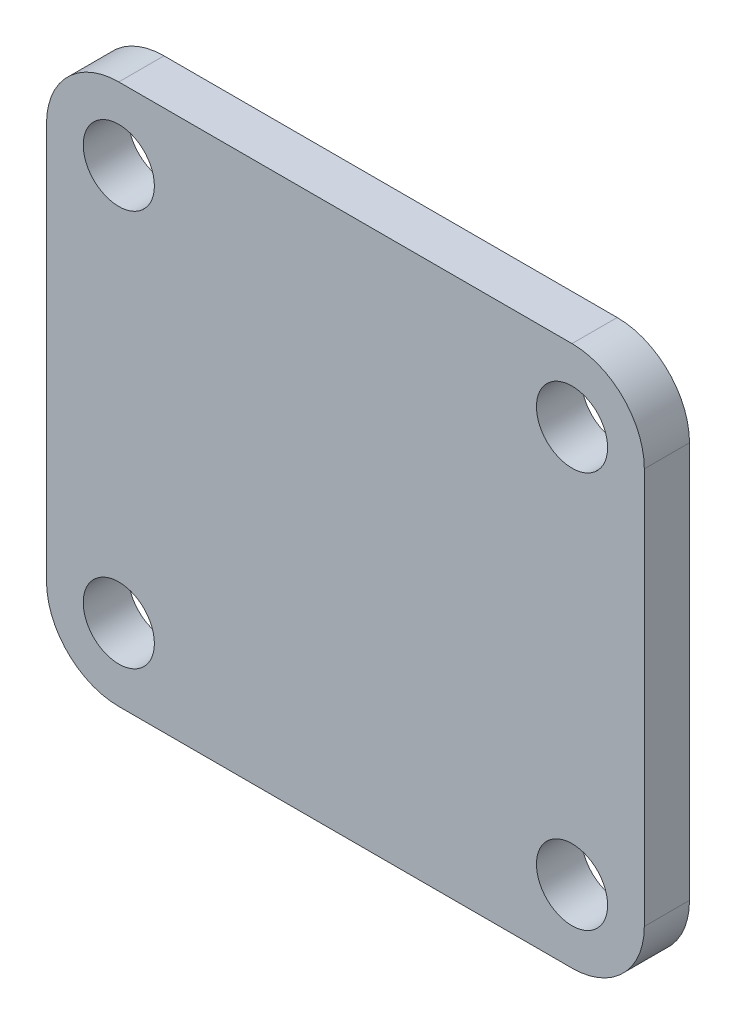
ISO-10303-21;
HEADER;
FILE_DESCRIPTION(('STEP AP214'),'2;1');
FILE_NAME('part.step','',(''),(''),'','','');
FILE_SCHEMA(('AUTOMOTIVE_DESIGN { 1 0 10303 214 1 1 1 1 }'));
ENDSEC;
DATA;
#1=APPLICATION_CONTEXT('core data for automotive mechanical design processes');
#2=APPLICATION_PROTOCOL_DEFINITION('international standard','automotive_design',2000,#1);
#3=PRODUCT_CONTEXT('',#1,'mechanical');
#4=PRODUCT('Part','Part','',(#3));
#5=PRODUCT_RELATED_PRODUCT_CATEGORY('part','',(#4));
#6=PRODUCT_DEFINITION_FORMATION('','',#4);
#7=PRODUCT_DEFINITION_CONTEXT('part definition',#1,'design');
#8=PRODUCT_DEFINITION('design','',#6,#7);
#9=PRODUCT_DEFINITION_SHAPE('','',#8);
#10=(LENGTH_UNIT() NAMED_UNIT(*) SI_UNIT(.MILLI.,.METRE.));
#11=(NAMED_UNIT(*) PLANE_ANGLE_UNIT() SI_UNIT($,.RADIAN.));
#12=(NAMED_UNIT(*) SI_UNIT($,.STERADIAN.) SOLID_ANGLE_UNIT());
#13=UNCERTAINTY_MEASURE_WITH_UNIT(LENGTH_MEASURE(1.E-05),#10,'distance_accuracy_value','');
#14=(GEOMETRIC_REPRESENTATION_CONTEXT(3) GLOBAL_UNCERTAINTY_ASSIGNED_CONTEXT((#13)) GLOBAL_UNIT_ASSIGNED_CONTEXT((#10,
#11,#12)) REPRESENTATION_CONTEXT('',''));
#15=CARTESIAN_POINT('',(0.,0.,0.));
#16=DIRECTION('',(0.,0.,1.));
#17=DIRECTION('',(1.,0.,0.));
#18=AXIS2_PLACEMENT_3D('',#15,#16,#17);
#19=CARTESIAN_POINT('',(-7.96,-6.96,1.5875));
#20=DIRECTION('',(0.,0.,-1.));
#21=DIRECTION('',(-1.,0.,0.));
#22=AXIS2_PLACEMENT_3D('',#19,#20,#21);
#23=CYLINDRICAL_SURFACE('',#22,2.54);
#24=CARTESIAN_POINT('',(-7.96,-6.96,0.));
#25=DIRECTION('',(0.,0.,1.));
#26=DIRECTION('',(-1.,0.,0.));
#27=AXIS2_PLACEMENT_3D('',#24,#25,#26);
#28=CIRCLE('',#27,2.54);
#29=CARTESIAN_POINT('',(-10.5,-6.96,0.));
#30=VERTEX_POINT('',#29);
#31=CARTESIAN_POINT('',(-7.96,-9.5,0.));
#32=VERTEX_POINT('',#31);
#33=EDGE_CURVE('E141',#30,#32,#28,.T.);
#34=ORIENTED_EDGE('',*,*,#33,.T.);
#35=DIRECTION('',(0.,0.,-1.));
#36=VECTOR('',#35,1.);
#37=CARTESIAN_POINT('',(-7.96,-9.5,1.5875));
#38=LINE('',#37,#36);
#39=CARTESIAN_POINT('',(-7.96,-9.5,1.5875));
#40=VERTEX_POINT('',#39);
#41=EDGE_CURVE('E11',#40,#32,#38,.T.);
#42=ORIENTED_EDGE('',*,*,#41,.F.);
#43=CARTESIAN_POINT('',(-7.96,-6.96,1.5875));
#44=DIRECTION('',(0.,0.,1.));
#45=DIRECTION('',(-1.,0.,0.));
#46=AXIS2_PLACEMENT_3D('',#43,#44,#45);
#47=CIRCLE('',#46,2.54);
#48=CARTESIAN_POINT('',(-10.5,-6.96,1.5875));
#49=VERTEX_POINT('',#48);
#50=EDGE_CURVE('E164',#49,#40,#47,.T.);
#51=ORIENTED_EDGE('',*,*,#50,.F.);
#52=DIRECTION('',(0.,0.,-1.));
#53=VECTOR('',#52,1.);
#54=CARTESIAN_POINT('',(-10.5,-6.96,1.5875));
#55=LINE('',#54,#53);
#56=EDGE_CURVE('E137',#49,#30,#55,.T.);
#57=ORIENTED_EDGE('',*,*,#56,.T.);
#58=EDGE_LOOP('',(#34,#42,#51,#57));
#59=FACE_BOUND('',#58,.T.);
#60=ADVANCED_FACE('F38',(#59),#23,.T.);
#61=CARTESIAN_POINT('',(7.96,-9.5,1.5875));
#62=DIRECTION('',(0.,1.,0.));
#63=DIRECTION('',(0.,0.,1.));
#64=AXIS2_PLACEMENT_3D('',#61,#62,#63);
#65=PLANE('',#64);
#66=DIRECTION('',(1.,0.,0.));
#67=VECTOR('',#66,1.);
#68=CARTESIAN_POINT('',(7.96,-9.5,0.));
#69=LINE('',#68,#67);
#70=CARTESIAN_POINT('',(7.96,-9.5,0.));
#71=VERTEX_POINT('',#70);
#72=EDGE_CURVE('E145',#32,#71,#69,.T.);
#73=ORIENTED_EDGE('',*,*,#72,.T.);
#74=DIRECTION('',(0.,0.,-1.));
#75=VECTOR('',#74,1.);
#76=CARTESIAN_POINT('',(7.96,-9.5,1.5875));
#77=LINE('',#76,#75);
#78=CARTESIAN_POINT('',(7.96,-9.5,1.5875));
#79=VERTEX_POINT('',#78);
#80=EDGE_CURVE('E47',#79,#71,#77,.T.);
#81=ORIENTED_EDGE('',*,*,#80,.F.);
#82=DIRECTION('',(1.,0.,0.));
#83=VECTOR('',#82,1.);
#84=CARTESIAN_POINT('',(7.96,-9.5,1.5875));
#85=LINE('',#84,#83);
#86=EDGE_CURVE('E98',#40,#79,#85,.T.);
#87=ORIENTED_EDGE('',*,*,#86,.F.);
#88=ORIENTED_EDGE('',*,*,#41,.T.);
#89=EDGE_LOOP('',(#73,#81,#87,#88));
#90=FACE_BOUND('',#89,.T.);
#91=ADVANCED_FACE('F266',(#90),#65,.F.);
#92=CARTESIAN_POINT('',(7.96,-6.96,1.5875));
#93=DIRECTION('',(0.,0.,-1.));
#94=DIRECTION('',(-1.,0.,0.));
#95=AXIS2_PLACEMENT_3D('',#92,#93,#94);
#96=CYLINDRICAL_SURFACE('',#95,2.54);
#97=CARTESIAN_POINT('',(7.96,-6.96,0.));
#98=DIRECTION('',(0.,0.,1.));
#99=DIRECTION('',(1.,0.,0.));
#100=AXIS2_PLACEMENT_3D('',#97,#98,#99);
#101=CIRCLE('',#100,2.54);
#102=CARTESIAN_POINT('',(10.5,-6.96,0.));
#103=VERTEX_POINT('',#102);
#104=EDGE_CURVE('E149',#71,#103,#101,.T.);
#105=ORIENTED_EDGE('',*,*,#104,.T.);
#106=DIRECTION('',(0.,0.,-1.));
#107=VECTOR('',#106,1.);
#108=CARTESIAN_POINT('',(10.5,-6.96,1.5875));
#109=LINE('',#108,#107);
#110=CARTESIAN_POINT('',(10.5,-6.96,1.5875));
#111=VERTEX_POINT('',#110);
#112=EDGE_CURVE('E175',#111,#103,#109,.T.);
#113=ORIENTED_EDGE('',*,*,#112,.F.);
#114=CARTESIAN_POINT('',(7.96,-6.96,1.5875));
#115=DIRECTION('',(0.,0.,1.));
#116=DIRECTION('',(1.,0.,0.));
#117=AXIS2_PLACEMENT_3D('',#114,#115,#116);
#118=CIRCLE('',#117,2.54);
#119=EDGE_CURVE('E186',#79,#111,#118,.T.);
#120=ORIENTED_EDGE('',*,*,#119,.F.);
#121=ORIENTED_EDGE('',*,*,#80,.T.);
#122=EDGE_LOOP('',(#105,#113,#120,#121));
#123=FACE_BOUND('',#122,.T.);
#124=ADVANCED_FACE('F184',(#123),#96,.T.);
#125=CARTESIAN_POINT('',(10.5,-6.96,1.5875));
#126=DIRECTION('',(-1.,0.,0.));
#127=DIRECTION('',(0.,0.,1.));
#128=AXIS2_PLACEMENT_3D('',#125,#126,#127);
#129=PLANE('',#128);
#130=DIRECTION('',(0.,1.,0.));
#131=VECTOR('',#130,1.);
#132=CARTESIAN_POINT('',(10.5,-6.96,0.));
#133=LINE('',#132,#131);
#134=CARTESIAN_POINT('',(10.5,6.96,0.));
#135=VERTEX_POINT('',#134);
#136=EDGE_CURVE('E152',#103,#135,#133,.T.);
#137=ORIENTED_EDGE('',*,*,#136,.T.);
#138=DIRECTION('',(0.,0.,-1.));
#139=VECTOR('',#138,1.);
#140=CARTESIAN_POINT('',(10.5,6.96,1.5875));
#141=LINE('',#140,#139);
#142=CARTESIAN_POINT('',(10.5,6.96,1.5875));
#143=VERTEX_POINT('',#142);
#144=EDGE_CURVE('E171',#143,#135,#141,.T.);
#145=ORIENTED_EDGE('',*,*,#144,.F.);
#146=DIRECTION('',(0.,1.,0.));
#147=VECTOR('',#146,1.);
#148=CARTESIAN_POINT('',(10.5,-6.96,1.5875));
#149=LINE('',#148,#147);
#150=EDGE_CURVE('E199',#111,#143,#149,.T.);
#151=ORIENTED_EDGE('',*,*,#150,.F.);
#152=ORIENTED_EDGE('',*,*,#112,.T.);
#153=EDGE_LOOP('',(#137,#145,#151,#152));
#154=FACE_BOUND('',#153,.T.);
#155=ADVANCED_FACE('F194',(#154),#129,.F.);
#156=CARTESIAN_POINT('',(7.96,6.96,1.5875));
#157=DIRECTION('',(0.,0.,-1.));
#158=DIRECTION('',(-1.,0.,0.));
#159=AXIS2_PLACEMENT_3D('',#156,#157,#158);
#160=CYLINDRICAL_SURFACE('',#159,2.54);
#161=CARTESIAN_POINT('',(7.96,6.96,0.));
#162=DIRECTION('',(0.,0.,1.));
#163=DIRECTION('',(1.,0.,0.));
#164=AXIS2_PLACEMENT_3D('',#161,#162,#163);
#165=CIRCLE('',#164,2.54);
#166=CARTESIAN_POINT('',(7.96,9.5,0.));
#167=VERTEX_POINT('',#166);
#168=EDGE_CURVE('E155',#135,#167,#165,.T.);
#169=ORIENTED_EDGE('',*,*,#168,.T.);
#170=DIRECTION('',(0.,0.,-1.));
#171=VECTOR('',#170,1.);
#172=CARTESIAN_POINT('',(7.96,9.5,1.5875));
#173=LINE('',#172,#171);
#174=CARTESIAN_POINT('',(7.96,9.5,1.5875));
#175=VERTEX_POINT('',#174);
#176=EDGE_CURVE('E128',#175,#167,#173,.T.);
#177=ORIENTED_EDGE('',*,*,#176,.F.);
#178=CARTESIAN_POINT('',(7.96,6.96,1.5875));
#179=DIRECTION('',(0.,0.,1.));
#180=DIRECTION('',(1.,0.,0.));
#181=AXIS2_PLACEMENT_3D('',#178,#179,#180);
#182=CIRCLE('',#181,2.54);
#183=EDGE_CURVE('E117',#143,#175,#182,.T.);
#184=ORIENTED_EDGE('',*,*,#183,.F.);
#185=ORIENTED_EDGE('',*,*,#144,.T.);
#186=EDGE_LOOP('',(#169,#177,#184,#185));
#187=FACE_BOUND('',#186,.T.);
#188=ADVANCED_FACE('F197',(#187),#160,.T.);
#189=CARTESIAN_POINT('',(7.96,9.5,1.5875));
#190=DIRECTION('',(0.,-1.,0.));
#191=DIRECTION('',(0.,0.,-1.));
#192=AXIS2_PLACEMENT_3D('',#189,#190,#191);
#193=PLANE('',#192);
#194=DIRECTION('',(-1.,0.,0.));
#195=VECTOR('',#194,1.);
#196=CARTESIAN_POINT('',(7.96,9.5,0.));
#197=LINE('',#196,#195);
#198=CARTESIAN_POINT('',(-7.96,9.5,0.));
#199=VERTEX_POINT('',#198);
#200=EDGE_CURVE('E126',#167,#199,#197,.T.);
#201=ORIENTED_EDGE('',*,*,#200,.T.);
#202=DIRECTION('',(0.,0.,-1.));
#203=VECTOR('',#202,1.);
#204=CARTESIAN_POINT('',(-7.96,9.5,1.5875));
#205=LINE('',#204,#203);
#206=CARTESIAN_POINT('',(-7.96,9.5,1.5875));
#207=VERTEX_POINT('',#206);
#208=EDGE_CURVE('E123',#207,#199,#205,.T.);
#209=ORIENTED_EDGE('',*,*,#208,.F.);
#210=DIRECTION('',(-1.,0.,0.));
#211=VECTOR('',#210,1.);
#212=CARTESIAN_POINT('',(7.96,9.5,1.5875));
#213=LINE('',#212,#211);
#214=EDGE_CURVE('E111',#175,#207,#213,.T.);
#215=ORIENTED_EDGE('',*,*,#214,.F.);
#216=ORIENTED_EDGE('',*,*,#176,.T.);
#217=EDGE_LOOP('',(#201,#209,#215,#216));
#218=FACE_BOUND('',#217,.T.);
#219=ADVANCED_FACE('F124',(#218),#193,.F.);
#220=CARTESIAN_POINT('',(-7.96,6.96,1.5875));
#221=DIRECTION('',(0.,0.,-1.));
#222=DIRECTION('',(-1.,0.,0.));
#223=AXIS2_PLACEMENT_3D('',#220,#221,#222);
#224=CYLINDRICAL_SURFACE('',#223,2.54);
#225=CARTESIAN_POINT('',(-7.96,6.96,0.));
#226=DIRECTION('',(0.,0.,1.));
#227=DIRECTION('',(1.,0.,0.));
#228=AXIS2_PLACEMENT_3D('',#225,#226,#227);
#229=CIRCLE('',#228,2.54);
#230=CARTESIAN_POINT('',(-10.5,6.96,0.));
#231=VERTEX_POINT('',#230);
#232=EDGE_CURVE('E84',#199,#231,#229,.T.);
#233=ORIENTED_EDGE('',*,*,#232,.T.);
#234=DIRECTION('',(0.,0.,-1.));
#235=VECTOR('',#234,1.);
#236=CARTESIAN_POINT('',(-10.5,6.96,1.5875));
#237=LINE('',#236,#235);
#238=CARTESIAN_POINT('',(-10.5,6.96,1.5875));
#239=VERTEX_POINT('',#238);
#240=EDGE_CURVE('E129',#239,#231,#237,.T.);
#241=ORIENTED_EDGE('',*,*,#240,.F.);
#242=CARTESIAN_POINT('',(-7.96,6.96,1.5875));
#243=DIRECTION('',(0.,0.,1.));
#244=DIRECTION('',(1.,0.,0.));
#245=AXIS2_PLACEMENT_3D('',#242,#243,#244);
#246=CIRCLE('',#245,2.54);
#247=EDGE_CURVE('E115',#207,#239,#246,.T.);
#248=ORIENTED_EDGE('',*,*,#247,.F.);
#249=ORIENTED_EDGE('',*,*,#208,.T.);
#250=EDGE_LOOP('',(#233,#241,#248,#249));
#251=FACE_BOUND('',#250,.T.);
#252=ADVANCED_FACE('F131',(#251),#224,.T.);
#253=CARTESIAN_POINT('',(-10.5,-6.96,1.5875));
#254=DIRECTION('',(1.,0.,0.));
#255=DIRECTION('',(0.,0.,-1.));
#256=AXIS2_PLACEMENT_3D('',#253,#254,#255);
#257=PLANE('',#256);
#258=DIRECTION('',(0.,-1.,0.));
#259=VECTOR('',#258,1.);
#260=CARTESIAN_POINT('',(-10.5,-6.96,0.));
#261=LINE('',#260,#259);
#262=EDGE_CURVE('E90',#231,#30,#261,.T.);
#263=ORIENTED_EDGE('',*,*,#262,.T.);
#264=ORIENTED_EDGE('',*,*,#56,.F.);
#265=DIRECTION('',(0.,-1.,0.));
#266=VECTOR('',#265,1.);
#267=CARTESIAN_POINT('',(-10.5,-6.96,1.5875));
#268=LINE('',#267,#266);
#269=EDGE_CURVE('E55',#239,#49,#268,.T.);
#270=ORIENTED_EDGE('',*,*,#269,.F.);
#271=ORIENTED_EDGE('',*,*,#240,.T.);
#272=EDGE_LOOP('',(#263,#264,#270,#271));
#273=FACE_BOUND('',#272,.T.);
#274=ADVANCED_FACE('F250',(#273),#257,.F.);
#275=CARTESIAN_POINT('',(-7.96,-6.96,1.5875));
#276=DIRECTION('',(0.,0.,-1.));
#277=DIRECTION('',(-1.,0.,0.));
#278=AXIS2_PLACEMENT_3D('',#275,#276,#277);
#279=PLANE('',#278);
#280=CARTESIAN_POINT('',(-7.96,-6.96,1.5875));
#281=DIRECTION('',(0.,0.,1.));
#282=DIRECTION('',(1.,0.,0.));
#283=AXIS2_PLACEMENT_3D('',#280,#281,#282);
#284=CIRCLE('',#283,1.25);
#285=CARTESIAN_POINT('',(-6.71,-6.96,1.5875));
#286=VERTEX_POINT('',#285);
#287=EDGE_CURVE('E217',#286,#286,#284,.T.);
#288=ORIENTED_EDGE('',*,*,#287,.F.);
#289=EDGE_LOOP('',(#288));
#290=FACE_BOUND('',#289,.T.);
#291=CARTESIAN_POINT('',(7.96,-6.96,1.5875));
#292=DIRECTION('',(0.,0.,1.));
#293=DIRECTION('',(1.,0.,0.));
#294=AXIS2_PLACEMENT_3D('',#291,#292,#293);
#295=CIRCLE('',#294,1.25);
#296=CARTESIAN_POINT('',(9.21,-6.96,1.5875));
#297=VERTEX_POINT('',#296);
#298=EDGE_CURVE('E224',#297,#297,#295,.T.);
#299=ORIENTED_EDGE('',*,*,#298,.F.);
#300=EDGE_LOOP('',(#299));
#301=FACE_BOUND('',#300,.T.);
#302=CARTESIAN_POINT('',(7.96,6.96,1.5875));
#303=DIRECTION('',(0.,0.,1.));
#304=DIRECTION('',(1.,0.,0.));
#305=AXIS2_PLACEMENT_3D('',#302,#303,#304);
#306=CIRCLE('',#305,1.25);
#307=CARTESIAN_POINT('',(9.21,6.96,1.5875));
#308=VERTEX_POINT('',#307);
#309=EDGE_CURVE('E232',#308,#308,#306,.T.);
#310=ORIENTED_EDGE('',*,*,#309,.F.);
#311=EDGE_LOOP('',(#310));
#312=FACE_BOUND('',#311,.T.);
#313=CARTESIAN_POINT('',(-7.96,6.96,1.5875));
#314=DIRECTION('',(0.,0.,1.));
#315=DIRECTION('',(1.,0.,0.));
#316=AXIS2_PLACEMENT_3D('',#313,#314,#315);
#317=CIRCLE('',#316,1.25);
#318=CARTESIAN_POINT('',(-6.71,6.96,1.5875));
#319=VERTEX_POINT('',#318);
#320=EDGE_CURVE('E209',#319,#319,#317,.T.);
#321=ORIENTED_EDGE('',*,*,#320,.F.);
#322=EDGE_LOOP('',(#321));
#323=FACE_BOUND('',#322,.T.);
#324=ORIENTED_EDGE('',*,*,#50,.T.);
#325=ORIENTED_EDGE('',*,*,#86,.T.);
#326=ORIENTED_EDGE('',*,*,#119,.T.);
#327=ORIENTED_EDGE('',*,*,#150,.T.);
#328=ORIENTED_EDGE('',*,*,#183,.T.);
#329=ORIENTED_EDGE('',*,*,#214,.T.);
#330=ORIENTED_EDGE('',*,*,#247,.T.);
#331=ORIENTED_EDGE('',*,*,#269,.T.);
#332=EDGE_LOOP('',(#324,#325,#326,#327,#328,#329,#330,#331));
#333=FACE_BOUND('',#332,.T.);
#334=ADVANCED_FACE('F113',(#290,#301,#312,#323,#333),#279,.F.);
#335=CARTESIAN_POINT('',(-7.96,-6.96,0.));
#336=DIRECTION('',(0.,0.,-1.));
#337=DIRECTION('',(-1.,0.,0.));
#338=AXIS2_PLACEMENT_3D('',#335,#336,#337);
#339=PLANE('',#338);
#340=CARTESIAN_POINT('',(-7.96,-6.96,0.));
#341=DIRECTION('',(0.,0.,1.));
#342=DIRECTION('',(1.,0.,0.));
#343=AXIS2_PLACEMENT_3D('',#340,#341,#342);
#344=CIRCLE('',#343,1.25);
#345=CARTESIAN_POINT('',(-6.71,-6.96,0.));
#346=VERTEX_POINT('',#345);
#347=EDGE_CURVE('E221',#346,#346,#344,.T.);
#348=ORIENTED_EDGE('',*,*,#347,.T.);
#349=EDGE_LOOP('',(#348));
#350=FACE_BOUND('',#349,.T.);
#351=CARTESIAN_POINT('',(7.96,-6.96,0.));
#352=DIRECTION('',(0.,0.,1.));
#353=DIRECTION('',(1.,0.,0.));
#354=AXIS2_PLACEMENT_3D('',#351,#352,#353);
#355=CIRCLE('',#354,1.25);
#356=CARTESIAN_POINT('',(9.21,-6.96,0.));
#357=VERTEX_POINT('',#356);
#358=EDGE_CURVE('E228',#357,#357,#355,.T.);
#359=ORIENTED_EDGE('',*,*,#358,.T.);
#360=EDGE_LOOP('',(#359));
#361=FACE_BOUND('',#360,.T.);
#362=CARTESIAN_POINT('',(7.96,6.96,0.));
#363=DIRECTION('',(0.,0.,1.));
#364=DIRECTION('',(1.,0.,0.));
#365=AXIS2_PLACEMENT_3D('',#362,#363,#364);
#366=CIRCLE('',#365,1.25);
#367=CARTESIAN_POINT('',(9.21,6.96,0.));
#368=VERTEX_POINT('',#367);
#369=EDGE_CURVE('E213',#368,#368,#366,.T.);
#370=ORIENTED_EDGE('',*,*,#369,.T.);
#371=EDGE_LOOP('',(#370));
#372=FACE_BOUND('',#371,.T.);
#373=CARTESIAN_POINT('',(-7.96,6.96,0.));
#374=DIRECTION('',(0.,0.,1.));
#375=DIRECTION('',(1.,0.,0.));
#376=AXIS2_PLACEMENT_3D('',#373,#374,#375);
#377=CIRCLE('',#376,1.25);
#378=CARTESIAN_POINT('',(-6.71,6.96,0.));
#379=VERTEX_POINT('',#378);
#380=EDGE_CURVE('E146',#379,#379,#377,.T.);
#381=ORIENTED_EDGE('',*,*,#380,.T.);
#382=EDGE_LOOP('',(#381));
#383=FACE_BOUND('',#382,.T.);
#384=ORIENTED_EDGE('',*,*,#33,.F.);
#385=ORIENTED_EDGE('',*,*,#262,.F.);
#386=ORIENTED_EDGE('',*,*,#232,.F.);
#387=ORIENTED_EDGE('',*,*,#200,.F.);
#388=ORIENTED_EDGE('',*,*,#168,.F.);
#389=ORIENTED_EDGE('',*,*,#136,.F.);
#390=ORIENTED_EDGE('',*,*,#104,.F.);
#391=ORIENTED_EDGE('',*,*,#72,.F.);
#392=EDGE_LOOP('',(#384,#385,#386,#387,#388,#389,#390,#391));
#393=FACE_BOUND('',#392,.T.);
#394=ADVANCED_FACE('F190',(#350,#361,#372,#383,#393),#339,.T.);
#395=CARTESIAN_POINT('',(-7.96,6.96,0.));
#396=DIRECTION('',(0.,0.,1.));
#397=DIRECTION('',(1.,0.,0.));
#398=AXIS2_PLACEMENT_3D('',#395,#396,#397);
#399=CYLINDRICAL_SURFACE('',#398,1.25);
#400=ORIENTED_EDGE('',*,*,#380,.F.);
#401=EDGE_LOOP('',(#400));
#402=FACE_BOUND('',#401,.T.);
#403=ORIENTED_EDGE('',*,*,#320,.T.);
#404=EDGE_LOOP('',(#403));
#405=FACE_BOUND('',#404,.T.);
#406=ADVANCED_FACE('F244',(#402,#405),#399,.F.);
#407=CARTESIAN_POINT('',(7.96,6.96,0.));
#408=DIRECTION('',(0.,0.,1.));
#409=DIRECTION('',(1.,0.,0.));
#410=AXIS2_PLACEMENT_3D('',#407,#408,#409);
#411=CYLINDRICAL_SURFACE('',#410,1.25);
#412=ORIENTED_EDGE('',*,*,#369,.F.);
#413=EDGE_LOOP('',(#412));
#414=FACE_BOUND('',#413,.T.);
#415=ORIENTED_EDGE('',*,*,#309,.T.);
#416=EDGE_LOOP('',(#415));
#417=FACE_BOUND('',#416,.T.);
#418=ADVANCED_FACE('F240',(#414,#417),#411,.F.);
#419=CARTESIAN_POINT('',(7.96,-6.96,0.));
#420=DIRECTION('',(0.,0.,1.));
#421=DIRECTION('',(1.,0.,0.));
#422=AXIS2_PLACEMENT_3D('',#419,#420,#421);
#423=CYLINDRICAL_SURFACE('',#422,1.25);
#424=ORIENTED_EDGE('',*,*,#358,.F.);
#425=EDGE_LOOP('',(#424));
#426=FACE_BOUND('',#425,.T.);
#427=ORIENTED_EDGE('',*,*,#298,.T.);
#428=EDGE_LOOP('',(#427));
#429=FACE_BOUND('',#428,.T.);
#430=ADVANCED_FACE('F243',(#426,#429),#423,.F.);
#431=CARTESIAN_POINT('',(-7.96,-6.96,0.));
#432=DIRECTION('',(0.,0.,1.));
#433=DIRECTION('',(1.,0.,0.));
#434=AXIS2_PLACEMENT_3D('',#431,#432,#433);
#435=CYLINDRICAL_SURFACE('',#434,1.25);
#436=ORIENTED_EDGE('',*,*,#347,.F.);
#437=EDGE_LOOP('',(#436));
#438=FACE_BOUND('',#437,.T.);
#439=ORIENTED_EDGE('',*,*,#287,.T.);
#440=EDGE_LOOP('',(#439));
#441=FACE_BOUND('',#440,.T.);
#442=ADVANCED_FACE('F332',(#438,#441),#435,.F.);
#443=CLOSED_SHELL('',(#60,#91,#124,#155,#188,#219,#252,#274,#334,#394,#406,#418,#430,#442));
#444=MANIFOLD_SOLID_BREP('B2',#443);
#445=ADVANCED_BREP_SHAPE_REPRESENTATION('',(#18,#444),#14);
#446=SHAPE_DEFINITION_REPRESENTATION(#9,#445);
ENDSEC;
END-ISO-10303-21;
